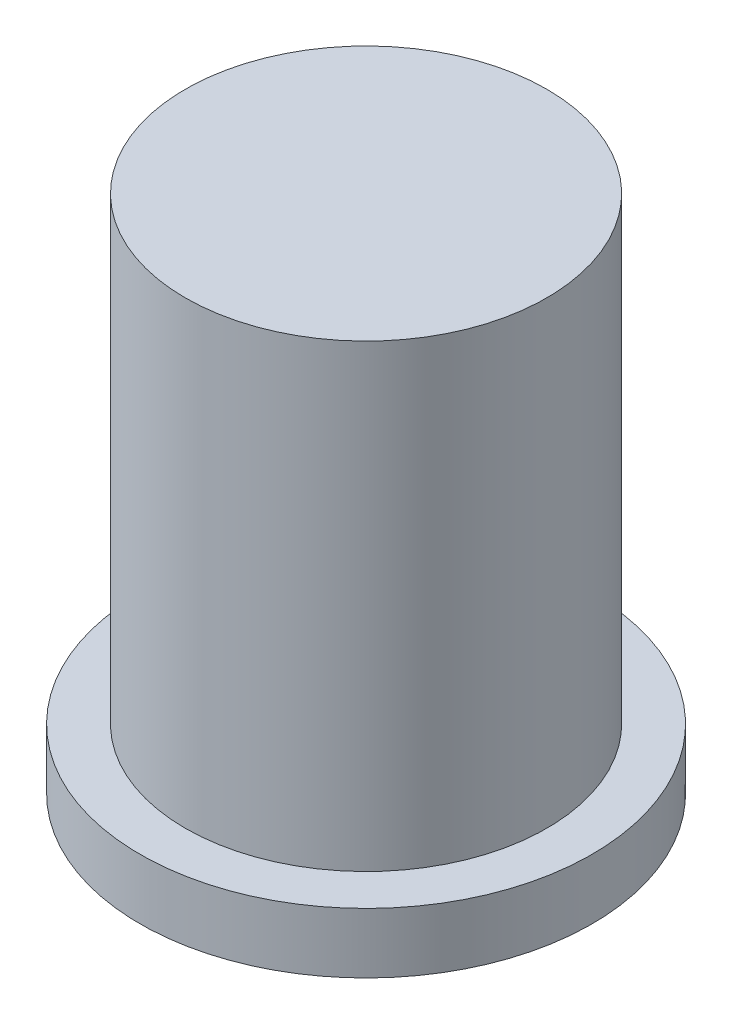
ISO-10303-21;
HEADER;
FILE_DESCRIPTION(('STEP AP214'),'2;1');
FILE_NAME('part.step','',(''),(''),'','','');
FILE_SCHEMA(('AUTOMOTIVE_DESIGN { 1 0 10303 214 1 1 1 1 }'));
ENDSEC;
DATA;
#1=APPLICATION_CONTEXT('core data for automotive mechanical design processes');
#2=APPLICATION_PROTOCOL_DEFINITION('international standard','automotive_design',2000,#1);
#3=PRODUCT_CONTEXT('',#1,'mechanical');
#4=PRODUCT('Part','Part','',(#3));
#5=PRODUCT_RELATED_PRODUCT_CATEGORY('part','',(#4));
#6=PRODUCT_DEFINITION_FORMATION('','',#4);
#7=PRODUCT_DEFINITION_CONTEXT('part definition',#1,'design');
#8=PRODUCT_DEFINITION('design','',#6,#7);
#9=PRODUCT_DEFINITION_SHAPE('','',#8);
#10=(LENGTH_UNIT() NAMED_UNIT(*) SI_UNIT(.MILLI.,.METRE.));
#11=(NAMED_UNIT(*) PLANE_ANGLE_UNIT() SI_UNIT($,.RADIAN.));
#12=(NAMED_UNIT(*) SI_UNIT($,.STERADIAN.) SOLID_ANGLE_UNIT());
#13=UNCERTAINTY_MEASURE_WITH_UNIT(LENGTH_MEASURE(1.E-05),#10,'distance_accuracy_value','');
#14=(GEOMETRIC_REPRESENTATION_CONTEXT(3) GLOBAL_UNCERTAINTY_ASSIGNED_CONTEXT((#13)) GLOBAL_UNIT_ASSIGNED_CONTEXT((#10,
#11,#12)) REPRESENTATION_CONTEXT('',''));
#15=CARTESIAN_POINT('',(0.,0.,0.));
#16=DIRECTION('',(0.,0.,1.));
#17=DIRECTION('',(1.,0.,0.));
#18=AXIS2_PLACEMENT_3D('',#15,#16,#17);
#19=CARTESIAN_POINT('',(0.,3.45,0.));
#20=DIRECTION('',(0.,-1.,0.));
#21=DIRECTION('',(0.,0.,-1.));
#22=AXIS2_PLACEMENT_3D('',#19,#20,#21);
#23=CYLINDRICAL_SURFACE('',#22,1.2);
#24=CARTESIAN_POINT('',(0.,3.45,0.));
#25=DIRECTION('',(0.,1.,0.));
#26=DIRECTION('',(0.,0.,1.));
#27=AXIS2_PLACEMENT_3D('',#24,#25,#26);
#28=CIRCLE('',#27,1.2);
#29=CARTESIAN_POINT('',(0.,3.45,-1.2));
#30=VERTEX_POINT('',#29);
#31=EDGE_CURVE('E37',#30,#30,#28,.T.);
#32=CARTESIAN_POINT('',(0.,0.4,0.));
#33=DIRECTION('',(0.,-1.,0.));
#34=DIRECTION('',(0.,0.,-1.));
#35=AXIS2_PLACEMENT_3D('',#32,#33,#34);
#36=CIRCLE('',#35,1.2);
#37=CARTESIAN_POINT('',(0.,0.4,-1.2));
#38=VERTEX_POINT('',#37);
#39=EDGE_CURVE('E10',#38,#38,#36,.T.);
#40=CARTESIAN_POINT('',(0.,3.45,-1.2));
#41=CARTESIAN_POINT('',(0.,3.41822916666667,-1.2));
#42=CARTESIAN_POINT('',(0.,3.38645833333333,-1.2));
#43=CARTESIAN_POINT('',(0.,3.32291666666667,-1.2));
#44=CARTESIAN_POINT('',(0.,3.29114583333333,-1.2));
#45=CARTESIAN_POINT('',(0.,3.22760416666667,-1.2));
#46=CARTESIAN_POINT('',(0.,3.19583333333333,-1.2));
#47=CARTESIAN_POINT('',(0.,3.13229166666667,-1.2));
#48=CARTESIAN_POINT('',(0.,3.10052083333333,-1.2));
#49=CARTESIAN_POINT('',(0.,3.03697916666667,-1.2));
#50=CARTESIAN_POINT('',(0.,3.00520833333333,-1.2));
#51=CARTESIAN_POINT('',(0.,2.94166666666667,-1.2));
#52=CARTESIAN_POINT('',(0.,2.90989583333333,-1.2));
#53=CARTESIAN_POINT('',(0.,2.84635416666667,-1.2));
#54=CARTESIAN_POINT('',(0.,2.81458333333333,-1.2));
#55=CARTESIAN_POINT('',(0.,2.75104166666667,-1.2));
#56=CARTESIAN_POINT('',(0.,2.71927083333333,-1.2));
#57=CARTESIAN_POINT('',(0.,2.65572916666667,-1.2));
#58=CARTESIAN_POINT('',(0.,2.62395833333333,-1.2));
#59=CARTESIAN_POINT('',(0.,2.56041666666667,-1.2));
#60=CARTESIAN_POINT('',(0.,2.52864583333333,-1.2));
#61=CARTESIAN_POINT('',(0.,2.46510416666667,-1.2));
#62=CARTESIAN_POINT('',(0.,2.43333333333333,-1.2));
#63=CARTESIAN_POINT('',(0.,2.36979166666667,-1.2));
#64=CARTESIAN_POINT('',(0.,2.33802083333333,-1.2));
#65=CARTESIAN_POINT('',(0.,2.27447916666667,-1.2));
#66=CARTESIAN_POINT('',(0.,2.24270833333333,-1.2));
#67=CARTESIAN_POINT('',(0.,2.17916666666667,-1.2));
#68=CARTESIAN_POINT('',(0.,2.14739583333333,-1.2));
#69=CARTESIAN_POINT('',(0.,2.08385416666667,-1.2));
#70=CARTESIAN_POINT('',(0.,2.05208333333333,-1.2));
#71=CARTESIAN_POINT('',(0.,1.98854166666667,-1.2));
#72=CARTESIAN_POINT('',(0.,1.95677083333333,-1.2));
#73=CARTESIAN_POINT('',(0.,1.89322916666667,-1.2));
#74=CARTESIAN_POINT('',(0.,1.86145833333333,-1.2));
#75=CARTESIAN_POINT('',(0.,1.79791666666667,-1.2));
#76=CARTESIAN_POINT('',(0.,1.76614583333333,-1.2));
#77=CARTESIAN_POINT('',(0.,1.70260416666667,-1.2));
#78=CARTESIAN_POINT('',(0.,1.67083333333333,-1.2));
#79=CARTESIAN_POINT('',(0.,1.60729166666667,-1.2));
#80=CARTESIAN_POINT('',(0.,1.57552083333333,-1.2));
#81=CARTESIAN_POINT('',(0.,1.51197916666667,-1.2));
#82=CARTESIAN_POINT('',(0.,1.48020833333333,-1.2));
#83=CARTESIAN_POINT('',(0.,1.41666666666667,-1.2));
#84=CARTESIAN_POINT('',(0.,1.38489583333333,-1.2));
#85=CARTESIAN_POINT('',(0.,1.32135416666667,-1.2));
#86=CARTESIAN_POINT('',(0.,1.28958333333333,-1.2));
#87=CARTESIAN_POINT('',(0.,1.22604166666667,-1.2));
#88=CARTESIAN_POINT('',(0.,1.19427083333333,-1.2));
#89=CARTESIAN_POINT('',(0.,1.13072916666667,-1.2));
#90=CARTESIAN_POINT('',(0.,1.09895833333333,-1.2));
#91=CARTESIAN_POINT('',(0.,1.03541666666667,-1.2));
#92=CARTESIAN_POINT('',(0.,1.00364583333333,-1.2));
#93=CARTESIAN_POINT('',(0.,0.940104166666667,-1.2));
#94=CARTESIAN_POINT('',(0.,0.908333333333333,-1.2));
#95=CARTESIAN_POINT('',(0.,0.844791666666667,-1.2));
#96=CARTESIAN_POINT('',(0.,0.813020833333334,-1.2));
#97=CARTESIAN_POINT('',(0.,0.749479166666667,-1.2));
#98=CARTESIAN_POINT('',(0.,0.717708333333334,-1.2));
#99=CARTESIAN_POINT('',(0.,0.654166666666667,-1.2));
#100=CARTESIAN_POINT('',(0.,0.622395833333333,-1.2));
#101=CARTESIAN_POINT('',(0.,0.558854166666667,-1.2));
#102=CARTESIAN_POINT('',(0.,0.527083333333333,-1.2));
#103=CARTESIAN_POINT('',(0.,0.463541666666667,-1.2));
#104=CARTESIAN_POINT('',(0.,0.431770833333333,-1.2));
#105=CARTESIAN_POINT('',(0.,0.4,-1.2));
#106=B_SPLINE_CURVE_WITH_KNOTS('',3,(#40,#41,#42,#43,#44,#45,#46,#47,#48,#49,#50,#51,#52,#53,
#54,#55,#56,#57,#58,#59,#60,#61,#62,#63,#64,#65,#66,#67,#68,#69,#70,#71,#72,#73,#74,#75,#76,#77,
#78,#79,#80,#81,#82,#83,#84,#85,#86,#87,#88,#89,#90,#91,#92,#93,#94,#95,#96,#97,#98,#99,#100,
#101,#102,#103,#104,#105),.UNSPECIFIED.,.F.,.F.,(4,2,2,2,2,2,2,2,2,2,2,2,2,2,2,2,2,2,2,2,2,2,2,
2,2,2,2,2,2,2,2,2,4),(0.,0.0953124999999999,0.190625,0.2859375,0.38125,0.4765625,
0.571874999999999,0.6671875,0.7625,0.8578125,0.953125,1.0484375,1.14375,1.2390625,1.334375,
1.4296875,1.525,1.6203125,1.715625,1.8109375,1.90625,2.0015625,2.096875,2.1921875,2.2875,
2.3828125,2.478125,2.5734375,2.66875,2.7640625,2.859375,2.9546875,3.05),.UNSPECIFIED.);
#107=EDGE_CURVE('BSEAM31',#30,#38,#106,.T.);
#108=ORIENTED_EDGE('',*,*,#31,.F.);
#109=ORIENTED_EDGE('',*,*,#39,.F.);
#110=ORIENTED_EDGE('',*,*,#107,.T.);
#111=ORIENTED_EDGE('',*,*,#107,.F.);
#112=EDGE_LOOP('',(#108,#110,#109,#111));
#113=FACE_BOUND('',#112,.T.);
#114=ADVANCED_FACE('F31',(#113),#23,.T.);
#115=CARTESIAN_POINT('',(0.,3.45,0.));
#116=DIRECTION('',(0.,1.,0.));
#117=DIRECTION('',(0.,0.,1.));
#118=AXIS2_PLACEMENT_3D('',#115,#116,#117);
#119=PLANE('',#118);
#120=ORIENTED_EDGE('',*,*,#31,.T.);
#121=EDGE_LOOP('',(#120));
#122=FACE_BOUND('',#121,.T.);
#123=ADVANCED_FACE('F56',(#122),#119,.T.);
#124=CARTESIAN_POINT('',(0.,0.4,0.));
#125=DIRECTION('',(0.,-1.,0.));
#126=DIRECTION('',(0.,0.,-1.));
#127=AXIS2_PLACEMENT_3D('',#124,#125,#126);
#128=CYLINDRICAL_SURFACE('',#127,1.5);
#129=CARTESIAN_POINT('',(0.,0.4,0.));
#130=DIRECTION('',(0.,-1.,0.));
#131=DIRECTION('',(0.,0.,-1.));
#132=AXIS2_PLACEMENT_3D('',#129,#130,#131);
#133=CIRCLE('',#132,1.5);
#134=CARTESIAN_POINT('',(0.,0.4,-1.5));
#135=VERTEX_POINT('',#134);
#136=EDGE_CURVE('E41',#135,#135,#133,.T.);
#137=ORIENTED_EDGE('',*,*,#136,.T.);
#138=EDGE_LOOP('',(#137));
#139=FACE_BOUND('',#138,.T.);
#140=CARTESIAN_POINT('',(0.,0.,0.));
#141=DIRECTION('',(0.,-1.,0.));
#142=DIRECTION('',(0.,0.,-1.));
#143=AXIS2_PLACEMENT_3D('',#140,#141,#142);
#144=CIRCLE('',#143,1.5);
#145=CARTESIAN_POINT('',(0.,0.,-1.5));
#146=VERTEX_POINT('',#145);
#147=EDGE_CURVE('E45',#146,#146,#144,.T.);
#148=ORIENTED_EDGE('',*,*,#147,.F.);
#149=EDGE_LOOP('',(#148));
#150=FACE_BOUND('',#149,.T.);
#151=ADVANCED_FACE('F53',(#139,#150),#128,.T.);
#152=CARTESIAN_POINT('',(0.,0.4,0.));
#153=DIRECTION('',(0.,-1.,0.));
#154=DIRECTION('',(0.,0.,-1.));
#155=AXIS2_PLACEMENT_3D('',#152,#153,#154);
#156=PLANE('',#155);
#157=ORIENTED_EDGE('',*,*,#39,.T.);
#158=EDGE_LOOP('',(#157));
#159=FACE_BOUND('',#158,.T.);
#160=ORIENTED_EDGE('',*,*,#136,.F.);
#161=EDGE_LOOP('',(#160));
#162=FACE_BOUND('',#161,.T.);
#163=ADVANCED_FACE('F55',(#159,#162),#156,.F.);
#164=CARTESIAN_POINT('',(0.,0.,0.));
#165=DIRECTION('',(0.,1.,0.));
#166=DIRECTION('',(0.,0.,1.));
#167=AXIS2_PLACEMENT_3D('',#164,#165,#166);
#168=PLANE('',#167);
#169=ORIENTED_EDGE('',*,*,#147,.T.);
#170=EDGE_LOOP('',(#169));
#171=FACE_BOUND('',#170,.T.);
#172=ADVANCED_FACE('F51',(#171),#168,.F.);
#173=CLOSED_SHELL('',(#114,#123,#151,#163,#172));
#174=MANIFOLD_SOLID_BREP('B2',#173);
#175=ADVANCED_BREP_SHAPE_REPRESENTATION('',(#18,#174),#14);
#176=SHAPE_DEFINITION_REPRESENTATION(#9,#175);
ENDSEC;
END-ISO-10303-21;
